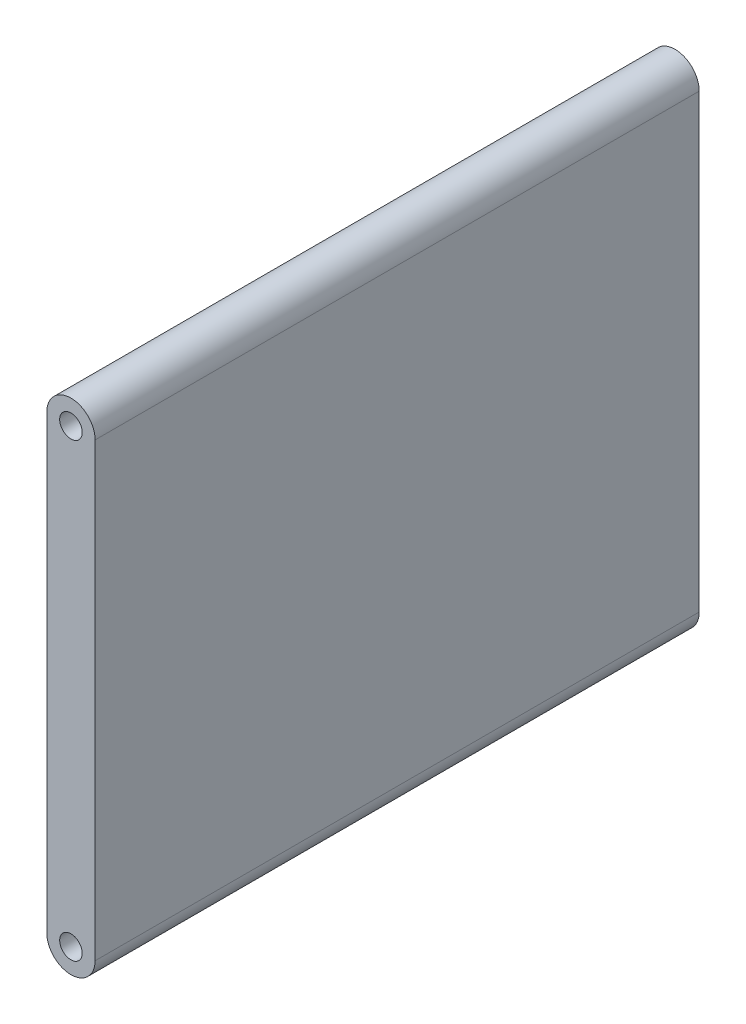
ISO-10303-21;
HEADER;
FILE_DESCRIPTION(('STEP AP214'),'2;1');
FILE_NAME('part.step','',(''),(''),'','','');
FILE_SCHEMA(('AUTOMOTIVE_DESIGN { 1 0 10303 214 1 1 1 1 }'));
ENDSEC;
DATA;
#1=APPLICATION_CONTEXT('core data for automotive mechanical design processes');
#2=APPLICATION_PROTOCOL_DEFINITION('international standard','automotive_design',2000,#1);
#3=PRODUCT_CONTEXT('',#1,'mechanical');
#4=PRODUCT('Part','Part','',(#3));
#5=PRODUCT_RELATED_PRODUCT_CATEGORY('part','',(#4));
#6=PRODUCT_DEFINITION_FORMATION('','',#4);
#7=PRODUCT_DEFINITION_CONTEXT('part definition',#1,'design');
#8=PRODUCT_DEFINITION('design','',#6,#7);
#9=PRODUCT_DEFINITION_SHAPE('','',#8);
#10=(LENGTH_UNIT() NAMED_UNIT(*) SI_UNIT(.MILLI.,.METRE.));
#11=(NAMED_UNIT(*) PLANE_ANGLE_UNIT() SI_UNIT($,.RADIAN.));
#12=(NAMED_UNIT(*) SI_UNIT($,.STERADIAN.) SOLID_ANGLE_UNIT());
#13=UNCERTAINTY_MEASURE_WITH_UNIT(LENGTH_MEASURE(1.E-05),#10,'distance_accuracy_value','');
#14=(GEOMETRIC_REPRESENTATION_CONTEXT(3) GLOBAL_UNCERTAINTY_ASSIGNED_CONTEXT((#13)) GLOBAL_UNIT_ASSIGNED_CONTEXT((#10,
#11,#12)) REPRESENTATION_CONTEXT('',''));
#15=CARTESIAN_POINT('',(0.,0.,0.));
#16=DIRECTION('',(0.,0.,1.));
#17=DIRECTION('',(1.,0.,0.));
#18=AXIS2_PLACEMENT_3D('',#15,#16,#17);
#19=CARTESIAN_POINT('',(0.,-28.,75.));
#20=DIRECTION('',(0.,0.,-1.));
#21=DIRECTION('',(-1.,0.,0.));
#22=AXIS2_PLACEMENT_3D('',#19,#20,#21);
#23=PLANE('',#22);
#24=CARTESIAN_POINT('',(0.,-28.,75.));
#25=DIRECTION('',(0.,0.,1.));
#26=DIRECTION('',(-1.,0.,0.));
#27=AXIS2_PLACEMENT_3D('',#24,#25,#26);
#28=CIRCLE('',#27,3.);
#29=CARTESIAN_POINT('',(-3.,-28.,75.));
#30=VERTEX_POINT('',#29);
#31=CARTESIAN_POINT('',(3.,-28.,75.));
#32=VERTEX_POINT('',#31);
#33=EDGE_CURVE('E92',#30,#32,#28,.T.);
#34=ORIENTED_EDGE('',*,*,#33,.T.);
#35=DIRECTION('',(0.,1.,0.));
#36=VECTOR('',#35,1.);
#37=CARTESIAN_POINT('',(3.,-28.,75.));
#38=LINE('',#37,#36);
#39=CARTESIAN_POINT('',(3.,28.,75.));
#40=VERTEX_POINT('',#39);
#41=EDGE_CURVE('E87',#32,#40,#38,.T.);
#42=ORIENTED_EDGE('',*,*,#41,.T.);
#43=CARTESIAN_POINT('',(0.,28.,75.));
#44=DIRECTION('',(0.,0.,1.));
#45=DIRECTION('',(1.,0.,0.));
#46=AXIS2_PLACEMENT_3D('',#43,#44,#45);
#47=CIRCLE('',#46,3.);
#48=CARTESIAN_POINT('',(-3.00000000000001,28.,75.));
#49=VERTEX_POINT('',#48);
#50=EDGE_CURVE('E90',#40,#49,#47,.T.);
#51=ORIENTED_EDGE('',*,*,#50,.T.);
#52=DIRECTION('',(0.,-1.,0.));
#53=VECTOR('',#52,1.);
#54=CARTESIAN_POINT('',(-3.,-28.,75.));
#55=LINE('',#54,#53);
#56=EDGE_CURVE('E57',#49,#30,#55,.T.);
#57=ORIENTED_EDGE('',*,*,#56,.T.);
#58=EDGE_LOOP('',(#34,#42,#51,#57));
#59=FACE_BOUND('',#58,.T.);
#60=CARTESIAN_POINT('',(0.,28.,75.));
#61=DIRECTION('',(0.,0.,1.));
#62=DIRECTION('',(1.,0.,0.));
#63=AXIS2_PLACEMENT_3D('',#60,#61,#62);
#64=CIRCLE('',#63,1.4);
#65=CARTESIAN_POINT('',(1.39999999999999,28.,75.));
#66=VERTEX_POINT('',#65);
#67=EDGE_CURVE('E112',#66,#66,#64,.T.);
#68=ORIENTED_EDGE('',*,*,#67,.F.);
#69=EDGE_LOOP('',(#68));
#70=FACE_BOUND('',#69,.T.);
#71=CARTESIAN_POINT('',(0.,-28.,75.));
#72=DIRECTION('',(0.,0.,1.));
#73=DIRECTION('',(1.,0.,0.));
#74=AXIS2_PLACEMENT_3D('',#71,#72,#73);
#75=CIRCLE('',#74,1.4);
#76=CARTESIAN_POINT('',(1.4,-28.,75.));
#77=VERTEX_POINT('',#76);
#78=EDGE_CURVE('E134',#77,#77,#75,.T.);
#79=ORIENTED_EDGE('',*,*,#78,.F.);
#80=EDGE_LOOP('',(#79));
#81=FACE_BOUND('',#80,.T.);
#82=ADVANCED_FACE('F39',(#59,#70,#81),#23,.F.);
#83=CARTESIAN_POINT('',(0.,-28.,0.));
#84=DIRECTION('',(0.,0.,-1.));
#85=DIRECTION('',(-1.,0.,0.));
#86=AXIS2_PLACEMENT_3D('',#83,#84,#85);
#87=PLANE('',#86);
#88=CARTESIAN_POINT('',(0.,28.,0.));
#89=DIRECTION('',(0.,0.,1.));
#90=DIRECTION('',(1.,0.,0.));
#91=AXIS2_PLACEMENT_3D('',#88,#89,#90);
#92=CIRCLE('',#91,1.4);
#93=CARTESIAN_POINT('',(1.39999999999999,28.,0.));
#94=VERTEX_POINT('',#93);
#95=EDGE_CURVE('E130',#94,#94,#92,.T.);
#96=ORIENTED_EDGE('',*,*,#95,.T.);
#97=EDGE_LOOP('',(#96));
#98=FACE_BOUND('',#97,.T.);
#99=CARTESIAN_POINT('',(0.,-28.,0.));
#100=DIRECTION('',(0.,0.,1.));
#101=DIRECTION('',(-1.,0.,0.));
#102=AXIS2_PLACEMENT_3D('',#99,#100,#101);
#103=CIRCLE('',#102,3.);
#104=CARTESIAN_POINT('',(-3.,-28.,0.));
#105=VERTEX_POINT('',#104);
#106=CARTESIAN_POINT('',(3.,-28.,0.));
#107=VERTEX_POINT('',#106);
#108=EDGE_CURVE('E108',#105,#107,#103,.T.);
#109=ORIENTED_EDGE('',*,*,#108,.F.);
#110=DIRECTION('',(0.,-1.,0.));
#111=VECTOR('',#110,1.);
#112=CARTESIAN_POINT('',(-3.,-28.,0.));
#113=LINE('',#112,#111);
#114=CARTESIAN_POINT('',(-3.00000000000001,28.,0.));
#115=VERTEX_POINT('',#114);
#116=EDGE_CURVE('E80',#115,#105,#113,.T.);
#117=ORIENTED_EDGE('',*,*,#116,.F.);
#118=CARTESIAN_POINT('',(0.,28.,0.));
#119=DIRECTION('',(0.,0.,1.));
#120=DIRECTION('',(1.,0.,0.));
#121=AXIS2_PLACEMENT_3D('',#118,#119,#120);
#122=CIRCLE('',#121,3.);
#123=CARTESIAN_POINT('',(3.,28.,0.));
#124=VERTEX_POINT('',#123);
#125=EDGE_CURVE('E74',#124,#115,#122,.T.);
#126=ORIENTED_EDGE('',*,*,#125,.F.);
#127=DIRECTION('',(0.,1.,0.));
#128=VECTOR('',#127,1.);
#129=CARTESIAN_POINT('',(3.,-28.,0.));
#130=LINE('',#129,#128);
#131=EDGE_CURVE('E97',#107,#124,#130,.T.);
#132=ORIENTED_EDGE('',*,*,#131,.F.);
#133=EDGE_LOOP('',(#109,#117,#126,#132));
#134=FACE_BOUND('',#133,.T.);
#135=CARTESIAN_POINT('',(0.,-28.,0.));
#136=DIRECTION('',(0.,0.,1.));
#137=DIRECTION('',(1.,0.,0.));
#138=AXIS2_PLACEMENT_3D('',#135,#136,#137);
#139=CIRCLE('',#138,1.4);
#140=CARTESIAN_POINT('',(1.4,-28.,0.));
#141=VERTEX_POINT('',#140);
#142=EDGE_CURVE('E138',#141,#141,#139,.T.);
#143=ORIENTED_EDGE('',*,*,#142,.T.);
#144=EDGE_LOOP('',(#143));
#145=FACE_BOUND('',#144,.T.);
#146=ADVANCED_FACE('F125',(#98,#134,#145),#87,.T.);
#147=CARTESIAN_POINT('',(0.,-28.,75.));
#148=DIRECTION('',(0.,0.,-1.));
#149=DIRECTION('',(-1.,0.,0.));
#150=AXIS2_PLACEMENT_3D('',#147,#148,#149);
#151=CYLINDRICAL_SURFACE('',#150,3.);
#152=ORIENTED_EDGE('',*,*,#108,.T.);
#153=DIRECTION('',(0.,0.,-1.));
#154=VECTOR('',#153,1.);
#155=CARTESIAN_POINT('',(3.,-28.,75.));
#156=LINE('',#155,#154);
#157=EDGE_CURVE('E11',#32,#107,#156,.T.);
#158=ORIENTED_EDGE('',*,*,#157,.F.);
#159=ORIENTED_EDGE('',*,*,#33,.F.);
#160=DIRECTION('',(0.,0.,-1.));
#161=VECTOR('',#160,1.);
#162=CARTESIAN_POINT('',(-3.,-28.,75.));
#163=LINE('',#162,#161);
#164=EDGE_CURVE('E104',#30,#105,#163,.T.);
#165=ORIENTED_EDGE('',*,*,#164,.T.);
#166=EDGE_LOOP('',(#152,#158,#159,#165));
#167=FACE_BOUND('',#166,.T.);
#168=ADVANCED_FACE('F41',(#167),#151,.T.);
#169=CARTESIAN_POINT('',(3.,-28.,75.));
#170=DIRECTION('',(-1.,0.,0.));
#171=DIRECTION('',(0.,0.,1.));
#172=AXIS2_PLACEMENT_3D('',#169,#170,#171);
#173=PLANE('',#172);
#174=ORIENTED_EDGE('',*,*,#131,.T.);
#175=DIRECTION('',(0.,0.,-1.));
#176=VECTOR('',#175,1.);
#177=CARTESIAN_POINT('',(3.,28.,75.));
#178=LINE('',#177,#176);
#179=EDGE_CURVE('E49',#40,#124,#178,.T.);
#180=ORIENTED_EDGE('',*,*,#179,.F.);
#181=ORIENTED_EDGE('',*,*,#41,.F.);
#182=ORIENTED_EDGE('',*,*,#157,.T.);
#183=EDGE_LOOP('',(#174,#180,#181,#182));
#184=FACE_BOUND('',#183,.T.);
#185=ADVANCED_FACE('F96',(#184),#173,.F.);
#186=CARTESIAN_POINT('',(0.,28.,75.));
#187=DIRECTION('',(0.,0.,-1.));
#188=DIRECTION('',(-1.,0.,0.));
#189=AXIS2_PLACEMENT_3D('',#186,#187,#188);
#190=CYLINDRICAL_SURFACE('',#189,3.);
#191=ORIENTED_EDGE('',*,*,#125,.T.);
#192=DIRECTION('',(0.,0.,-1.));
#193=VECTOR('',#192,1.);
#194=CARTESIAN_POINT('',(-3.00000000000001,28.,75.));
#195=LINE('',#194,#193);
#196=EDGE_CURVE('E99',#49,#115,#195,.T.);
#197=ORIENTED_EDGE('',*,*,#196,.F.);
#198=ORIENTED_EDGE('',*,*,#50,.F.);
#199=ORIENTED_EDGE('',*,*,#179,.T.);
#200=EDGE_LOOP('',(#191,#197,#198,#199));
#201=FACE_BOUND('',#200,.T.);
#202=ADVANCED_FACE('F100',(#201),#190,.T.);
#203=CARTESIAN_POINT('',(-3.,-28.,75.));
#204=DIRECTION('',(1.,0.,0.));
#205=DIRECTION('',(0.,0.,-1.));
#206=AXIS2_PLACEMENT_3D('',#203,#204,#205);
#207=PLANE('',#206);
#208=ORIENTED_EDGE('',*,*,#116,.T.);
#209=ORIENTED_EDGE('',*,*,#164,.F.);
#210=ORIENTED_EDGE('',*,*,#56,.F.);
#211=ORIENTED_EDGE('',*,*,#196,.T.);
#212=EDGE_LOOP('',(#208,#209,#210,#211));
#213=FACE_BOUND('',#212,.T.);
#214=ADVANCED_FACE('F122',(#213),#207,.F.);
#215=CARTESIAN_POINT('',(0.,28.,75.));
#216=DIRECTION('',(0.,0.,-1.));
#217=DIRECTION('',(-1.,0.,0.));
#218=AXIS2_PLACEMENT_3D('',#215,#216,#217);
#219=CYLINDRICAL_SURFACE('',#218,1.4);
#220=ORIENTED_EDGE('',*,*,#67,.T.);
#221=EDGE_LOOP('',(#220));
#222=FACE_BOUND('',#221,.T.);
#223=ORIENTED_EDGE('',*,*,#95,.F.);
#224=EDGE_LOOP('',(#223));
#225=FACE_BOUND('',#224,.T.);
#226=ADVANCED_FACE('F157',(#222,#225),#219,.F.);
#227=CARTESIAN_POINT('',(0.,-28.,75.));
#228=DIRECTION('',(0.,0.,-1.));
#229=DIRECTION('',(-1.,0.,0.));
#230=AXIS2_PLACEMENT_3D('',#227,#228,#229);
#231=CYLINDRICAL_SURFACE('',#230,1.4);
#232=ORIENTED_EDGE('',*,*,#78,.T.);
#233=EDGE_LOOP('',(#232));
#234=FACE_BOUND('',#233,.T.);
#235=ORIENTED_EDGE('',*,*,#142,.F.);
#236=EDGE_LOOP('',(#235));
#237=FACE_BOUND('',#236,.T.);
#238=ADVANCED_FACE('F146',(#234,#237),#231,.F.);
#239=CLOSED_SHELL('',(#82,#146,#168,#185,#202,#214,#226,#238));
#240=MANIFOLD_SOLID_BREP('B2',#239);
#241=ADVANCED_BREP_SHAPE_REPRESENTATION('',(#18,#240),#14);
#242=SHAPE_DEFINITION_REPRESENTATION(#9,#241);
ENDSEC;
END-ISO-10303-21;
